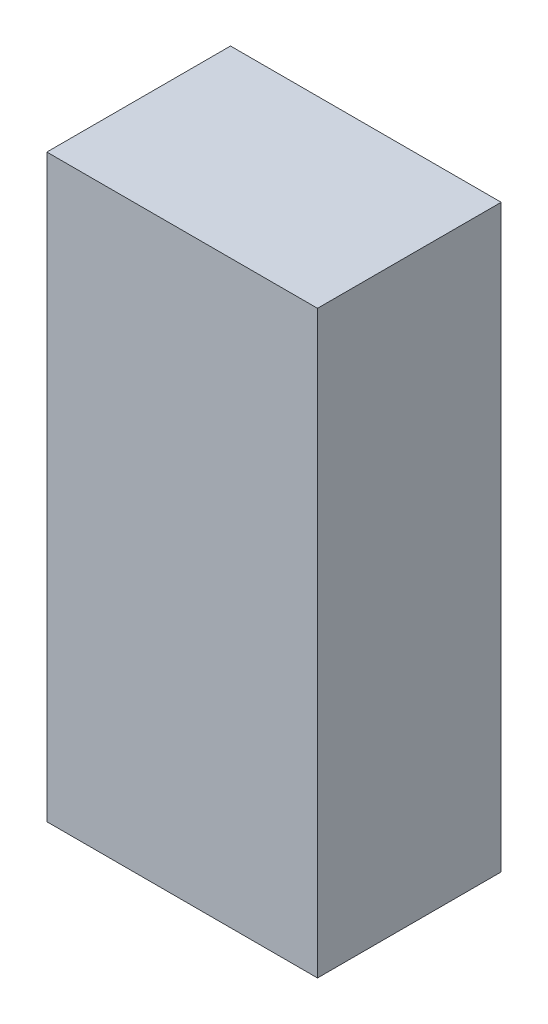
ISO-10303-21;
HEADER;
FILE_DESCRIPTION(('STEP AP214'),'2;1');
FILE_NAME('part.step','',(''),(''),'','','');
FILE_SCHEMA(('AUTOMOTIVE_DESIGN { 1 0 10303 214 1 1 1 1 }'));
ENDSEC;
DATA;
#1=APPLICATION_CONTEXT('core data for automotive mechanical design processes');
#2=APPLICATION_PROTOCOL_DEFINITION('international standard','automotive_design',2000,#1);
#3=PRODUCT_CONTEXT('',#1,'mechanical');
#4=PRODUCT('Part','Part','',(#3));
#5=PRODUCT_RELATED_PRODUCT_CATEGORY('part','',(#4));
#6=PRODUCT_DEFINITION_FORMATION('','',#4);
#7=PRODUCT_DEFINITION_CONTEXT('part definition',#1,'design');
#8=PRODUCT_DEFINITION('design','',#6,#7);
#9=PRODUCT_DEFINITION_SHAPE('','',#8);
#10=(LENGTH_UNIT() NAMED_UNIT(*) SI_UNIT(.MILLI.,.METRE.));
#11=(NAMED_UNIT(*) PLANE_ANGLE_UNIT() SI_UNIT($,.RADIAN.));
#12=(NAMED_UNIT(*) SI_UNIT($,.STERADIAN.) SOLID_ANGLE_UNIT());
#13=UNCERTAINTY_MEASURE_WITH_UNIT(LENGTH_MEASURE(1.E-05),#10,'distance_accuracy_value','');
#14=(GEOMETRIC_REPRESENTATION_CONTEXT(3) GLOBAL_UNCERTAINTY_ASSIGNED_CONTEXT((#13)) GLOBAL_UNIT_ASSIGNED_CONTEXT((#10,
#11,#12)) REPRESENTATION_CONTEXT('',''));
#15=CARTESIAN_POINT('',(0.,0.,0.));
#16=DIRECTION('',(0.,0.,1.));
#17=DIRECTION('',(1.,0.,0.));
#18=AXIS2_PLACEMENT_3D('',#15,#16,#17);
#19=CARTESIAN_POINT('',(0.70000114,-1.49999954,0.));
#20=DIRECTION('',(0.,0.,-1.));
#21=DIRECTION('',(-1.,0.,0.));
#22=AXIS2_PLACEMENT_3D('',#19,#20,#21);
#23=PLANE('',#22);
#24=DIRECTION('',(-1.,0.,0.));
#25=VECTOR('',#24,1.);
#26=CARTESIAN_POINT('',(0.70000114,1.49999954,0.));
#27=LINE('',#26,#25);
#28=CARTESIAN_POINT('',(-0.6999986,1.49999954,0.));
#29=VERTEX_POINT('',#28);
#30=CARTESIAN_POINT('',(0.70000114,1.49999954,0.));
#31=VERTEX_POINT('',#30);
#32=EDGE_CURVE('E21',#29,#31,#27,.F.);
#33=ORIENTED_EDGE('',*,*,#32,.T.);
#34=DIRECTION('',(0.,1.,0.));
#35=VECTOR('',#34,1.);
#36=CARTESIAN_POINT('',(0.70000114,-1.49999954,0.));
#37=LINE('',#36,#35);
#38=CARTESIAN_POINT('',(0.70000114,-1.49999954,0.));
#39=VERTEX_POINT('',#38);
#40=EDGE_CURVE('E59',#31,#39,#37,.F.);
#41=ORIENTED_EDGE('',*,*,#40,.T.);
#42=DIRECTION('',(1.,0.,0.));
#43=VECTOR('',#42,1.);
#44=CARTESIAN_POINT('',(-0.6999986,-1.49999954,0.));
#45=LINE('',#44,#43);
#46=CARTESIAN_POINT('',(-0.6999986,-1.49999954,0.));
#47=VERTEX_POINT('',#46);
#48=EDGE_CURVE('E56',#39,#47,#45,.F.);
#49=ORIENTED_EDGE('',*,*,#48,.T.);
#50=DIRECTION('',(0.,1.,0.));
#51=VECTOR('',#50,1.);
#52=CARTESIAN_POINT('',(-0.6999986,1.49999954,0.));
#53=LINE('',#52,#51);
#54=EDGE_CURVE('E78',#47,#29,#53,.T.);
#55=ORIENTED_EDGE('',*,*,#54,.T.);
#56=EDGE_LOOP('',(#33,#41,#49,#55));
#57=FACE_BOUND('',#56,.T.);
#58=ADVANCED_FACE('F18',(#57),#23,.T.);
#59=CARTESIAN_POINT('',(0.70000114,-1.49999954,0.));
#60=DIRECTION('',(-1.,0.,0.));
#61=DIRECTION('',(0.,0.,1.));
#62=AXIS2_PLACEMENT_3D('',#59,#60,#61);
#63=PLANE('',#62);
#64=DIRECTION('',(0.,0.,-1.));
#65=VECTOR('',#64,1.);
#66=CARTESIAN_POINT('',(0.70000114,1.49999954,0.));
#67=LINE('',#66,#65);
#68=CARTESIAN_POINT('',(0.70000114,1.49999954,0.95000064));
#69=VERTEX_POINT('',#68);
#70=EDGE_CURVE('E80',#31,#69,#67,.F.);
#71=ORIENTED_EDGE('',*,*,#70,.T.);
#72=DIRECTION('',(0.,1.,0.));
#73=VECTOR('',#72,1.);
#74=CARTESIAN_POINT('',(0.70000114,-1.49999954,0.95000064));
#75=LINE('',#74,#73);
#76=CARTESIAN_POINT('',(0.70000114,-1.49999954,0.95000064));
#77=VERTEX_POINT('',#76);
#78=EDGE_CURVE('E74',#69,#77,#75,.F.);
#79=ORIENTED_EDGE('',*,*,#78,.T.);
#80=DIRECTION('',(0.,0.,1.));
#81=VECTOR('',#80,1.);
#82=CARTESIAN_POINT('',(0.70000114,-1.49999954,0.));
#83=LINE('',#82,#81);
#84=EDGE_CURVE('E64',#77,#39,#83,.F.);
#85=ORIENTED_EDGE('',*,*,#84,.T.);
#86=ORIENTED_EDGE('',*,*,#40,.F.);
#87=EDGE_LOOP('',(#71,#79,#85,#86));
#88=FACE_BOUND('',#87,.T.);
#89=ADVANCED_FACE('F73',(#88),#63,.F.);
#90=CARTESIAN_POINT('',(-0.6999986,-1.49999954,0.));
#91=DIRECTION('',(0.,1.,0.));
#92=DIRECTION('',(0.,0.,1.));
#93=AXIS2_PLACEMENT_3D('',#90,#91,#92);
#94=PLANE('',#93);
#95=ORIENTED_EDGE('',*,*,#84,.F.);
#96=DIRECTION('',(-1.,0.,0.));
#97=VECTOR('',#96,1.);
#98=CARTESIAN_POINT('',(0.70000114,-1.49999954,0.95000064));
#99=LINE('',#98,#97);
#100=CARTESIAN_POINT('',(-0.6999986,-1.49999954,0.95000064));
#101=VERTEX_POINT('',#100);
#102=EDGE_CURVE('E84',#77,#101,#99,.T.);
#103=ORIENTED_EDGE('',*,*,#102,.T.);
#104=DIRECTION('',(0.,0.,-1.));
#105=VECTOR('',#104,1.);
#106=CARTESIAN_POINT('',(-0.6999986,-1.49999954,0.));
#107=LINE('',#106,#105);
#108=EDGE_CURVE('E70',#101,#47,#107,.T.);
#109=ORIENTED_EDGE('',*,*,#108,.T.);
#110=ORIENTED_EDGE('',*,*,#48,.F.);
#111=EDGE_LOOP('',(#95,#103,#109,#110));
#112=FACE_BOUND('',#111,.T.);
#113=ADVANCED_FACE('F67',(#112),#94,.F.);
#114=CARTESIAN_POINT('',(-0.6999986,1.49999954,0.));
#115=DIRECTION('',(1.,0.,0.));
#116=DIRECTION('',(0.,0.,-1.));
#117=AXIS2_PLACEMENT_3D('',#114,#115,#116);
#118=PLANE('',#117);
#119=ORIENTED_EDGE('',*,*,#108,.F.);
#120=DIRECTION('',(0.,1.,0.));
#121=VECTOR('',#120,1.);
#122=CARTESIAN_POINT('',(-0.6999986,-1.49999954,0.95000064));
#123=LINE('',#122,#121);
#124=CARTESIAN_POINT('',(-0.6999986,1.49999954,0.95000064));
#125=VERTEX_POINT('',#124);
#126=EDGE_CURVE('E27',#101,#125,#123,.T.);
#127=ORIENTED_EDGE('',*,*,#126,.T.);
#128=DIRECTION('',(0.,0.,-1.));
#129=VECTOR('',#128,1.);
#130=CARTESIAN_POINT('',(-0.6999986,1.49999954,0.));
#131=LINE('',#130,#129);
#132=EDGE_CURVE('E35',#125,#29,#131,.T.);
#133=ORIENTED_EDGE('',*,*,#132,.T.);
#134=ORIENTED_EDGE('',*,*,#54,.F.);
#135=EDGE_LOOP('',(#119,#127,#133,#134));
#136=FACE_BOUND('',#135,.T.);
#137=ADVANCED_FACE('F89',(#136),#118,.F.);
#138=CARTESIAN_POINT('',(0.70000114,1.49999954,0.));
#139=DIRECTION('',(0.,-1.,0.));
#140=DIRECTION('',(0.,0.,-1.));
#141=AXIS2_PLACEMENT_3D('',#138,#139,#140);
#142=PLANE('',#141);
#143=ORIENTED_EDGE('',*,*,#132,.F.);
#144=DIRECTION('',(-1.,0.,0.));
#145=VECTOR('',#144,1.);
#146=CARTESIAN_POINT('',(0.70000114,1.49999954,0.95000064));
#147=LINE('',#146,#145);
#148=EDGE_CURVE('E11',#125,#69,#147,.F.);
#149=ORIENTED_EDGE('',*,*,#148,.T.);
#150=ORIENTED_EDGE('',*,*,#70,.F.);
#151=ORIENTED_EDGE('',*,*,#32,.F.);
#152=EDGE_LOOP('',(#143,#149,#150,#151));
#153=FACE_BOUND('',#152,.T.);
#154=ADVANCED_FACE('F92',(#153),#142,.F.);
#155=CARTESIAN_POINT('',(0.70000114,-1.49999954,0.95000064));
#156=DIRECTION('',(0.,0.,-1.));
#157=DIRECTION('',(-1.,0.,0.));
#158=AXIS2_PLACEMENT_3D('',#155,#156,#157);
#159=PLANE('',#158);
#160=ORIENTED_EDGE('',*,*,#126,.F.);
#161=ORIENTED_EDGE('',*,*,#102,.F.);
#162=ORIENTED_EDGE('',*,*,#78,.F.);
#163=ORIENTED_EDGE('',*,*,#148,.F.);
#164=EDGE_LOOP('',(#160,#161,#162,#163));
#165=FACE_BOUND('',#164,.T.);
#166=ADVANCED_FACE('F91',(#165),#159,.F.);
#167=CLOSED_SHELL('',(#58,#89,#113,#137,#154,#166));
#168=MANIFOLD_SOLID_BREP('B1',#167);
#169=ADVANCED_BREP_SHAPE_REPRESENTATION('',(#18,#168),#14);
#170=SHAPE_DEFINITION_REPRESENTATION(#9,#169);
ENDSEC;
END-ISO-10303-21;
